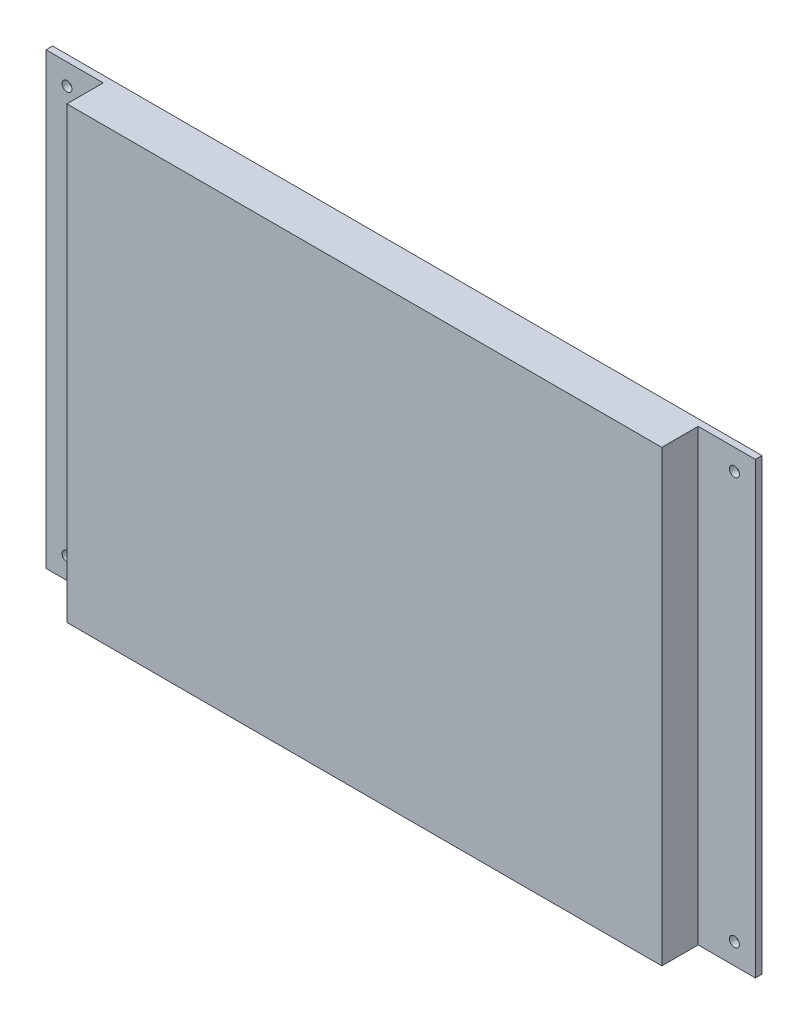
ISO-10303-21;
HEADER;
FILE_DESCRIPTION(('STEP AP214'),'2;1');
FILE_NAME('part.step','',(''),(''),'','','');
FILE_SCHEMA(('AUTOMOTIVE_DESIGN { 1 0 10303 214 1 1 1 1 }'));
ENDSEC;
DATA;
#1=APPLICATION_CONTEXT('core data for automotive mechanical design processes');
#2=APPLICATION_PROTOCOL_DEFINITION('international standard','automotive_design',2000,#1);
#3=PRODUCT_CONTEXT('',#1,'mechanical');
#4=PRODUCT('Part','Part','',(#3));
#5=PRODUCT_RELATED_PRODUCT_CATEGORY('part','',(#4));
#6=PRODUCT_DEFINITION_FORMATION('','',#4);
#7=PRODUCT_DEFINITION_CONTEXT('part definition',#1,'design');
#8=PRODUCT_DEFINITION('design','',#6,#7);
#9=PRODUCT_DEFINITION_SHAPE('','',#8);
#10=(LENGTH_UNIT() NAMED_UNIT(*) SI_UNIT(.MILLI.,.METRE.));
#11=(NAMED_UNIT(*) PLANE_ANGLE_UNIT() SI_UNIT($,.RADIAN.));
#12=(NAMED_UNIT(*) SI_UNIT($,.STERADIAN.) SOLID_ANGLE_UNIT());
#13=UNCERTAINTY_MEASURE_WITH_UNIT(LENGTH_MEASURE(1.E-05),#10,'distance_accuracy_value','');
#14=(GEOMETRIC_REPRESENTATION_CONTEXT(3) GLOBAL_UNCERTAINTY_ASSIGNED_CONTEXT((#13)) GLOBAL_UNIT_ASSIGNED_CONTEXT((#10,
#11,#12)) REPRESENTATION_CONTEXT('',''));
#15=CARTESIAN_POINT('',(0.,0.,0.));
#16=DIRECTION('',(0.,0.,1.));
#17=DIRECTION('',(1.,0.,0.));
#18=AXIS2_PLACEMENT_3D('',#15,#16,#17);
#19=CARTESIAN_POINT('',(0.,0.,2.));
#20=DIRECTION('',(0.,0.,-1.));
#21=DIRECTION('',(-1.,0.,0.));
#22=AXIS2_PLACEMENT_3D('',#19,#20,#21);
#23=PLANE('',#22);
#24=CARTESIAN_POINT('',(-100.965,61.595,2.));
#25=DIRECTION('',(0.,0.,1.));
#26=DIRECTION('',(-1.,0.,0.));
#27=AXIS2_PLACEMENT_3D('',#24,#25,#26);
#28=CIRCLE('',#27,1.5);
#29=CARTESIAN_POINT('',(-102.465,61.595,2.));
#30=VERTEX_POINT('',#29);
#31=EDGE_CURVE('E123',#30,#30,#28,.T.);
#32=ORIENTED_EDGE('',*,*,#31,.F.);
#33=EDGE_LOOP('',(#32));
#34=FACE_BOUND('',#33,.T.);
#35=CARTESIAN_POINT('',(-100.965,-61.595,2.));
#36=DIRECTION('',(0.,0.,1.));
#37=DIRECTION('',(-1.,0.,0.));
#38=AXIS2_PLACEMENT_3D('',#35,#36,#37);
#39=CIRCLE('',#38,1.5);
#40=CARTESIAN_POINT('',(-102.465,-61.595,2.));
#41=VERTEX_POINT('',#40);
#42=EDGE_CURVE('E132',#41,#41,#39,.T.);
#43=ORIENTED_EDGE('',*,*,#42,.F.);
#44=EDGE_LOOP('',(#43));
#45=FACE_BOUND('',#44,.T.);
#46=DIRECTION('',(0.,-1.,0.));
#47=VECTOR('',#46,1.);
#48=CARTESIAN_POINT('',(-90.,-67.945,2.));
#49=LINE('',#48,#47);
#50=CARTESIAN_POINT('',(-90.,67.945,2.));
#51=VERTEX_POINT('',#50);
#52=CARTESIAN_POINT('',(-90.,-67.945,2.));
#53=VERTEX_POINT('',#52);
#54=EDGE_CURVE('E119',#51,#53,#49,.T.);
#55=ORIENTED_EDGE('',*,*,#54,.F.);
#56=DIRECTION('',(-1.,0.,0.));
#57=VECTOR('',#56,1.);
#58=CARTESIAN_POINT('',(-107.315,67.945,2.));
#59=LINE('',#58,#57);
#60=CARTESIAN_POINT('',(-107.315,67.945,2.));
#61=VERTEX_POINT('',#60);
#62=EDGE_CURVE('E153',#51,#61,#59,.T.);
#63=ORIENTED_EDGE('',*,*,#62,.T.);
#64=DIRECTION('',(0.,-1.,0.));
#65=VECTOR('',#64,1.);
#66=CARTESIAN_POINT('',(-107.315,-67.945,2.));
#67=LINE('',#66,#65);
#68=CARTESIAN_POINT('',(-107.315,-67.945,2.));
#69=VERTEX_POINT('',#68);
#70=EDGE_CURVE('E157',#61,#69,#67,.T.);
#71=ORIENTED_EDGE('',*,*,#70,.T.);
#72=DIRECTION('',(1.,0.,0.));
#73=VECTOR('',#72,1.);
#74=CARTESIAN_POINT('',(-107.315,-67.945,2.));
#75=LINE('',#74,#73);
#76=EDGE_CURVE('E56',#69,#53,#75,.T.);
#77=ORIENTED_EDGE('',*,*,#76,.T.);
#78=EDGE_LOOP('',(#55,#63,#71,#77));
#79=FACE_BOUND('',#78,.T.);
#80=ADVANCED_FACE('F33',(#34,#45,#79),#23,.F.);
#81=CARTESIAN_POINT('',(100.965,-61.595,2.));
#82=DIRECTION('',(0.,0.,1.));
#83=DIRECTION('',(1.,0.,0.));
#84=AXIS2_PLACEMENT_3D('',#81,#82,#83);
#85=CIRCLE('',#84,1.5);
#86=CARTESIAN_POINT('',(102.465,-61.595,2.));
#87=VERTEX_POINT('',#86);
#88=EDGE_CURVE('E138',#87,#87,#85,.T.);
#89=ORIENTED_EDGE('',*,*,#88,.F.);
#90=EDGE_LOOP('',(#89));
#91=FACE_BOUND('',#90,.T.);
#92=CARTESIAN_POINT('',(100.965,61.595,2.));
#93=DIRECTION('',(0.,0.,1.));
#94=DIRECTION('',(1.,0.,0.));
#95=AXIS2_PLACEMENT_3D('',#92,#93,#94);
#96=CIRCLE('',#95,1.5);
#97=CARTESIAN_POINT('',(102.465,61.595,2.));
#98=VERTEX_POINT('',#97);
#99=EDGE_CURVE('E144',#98,#98,#96,.T.);
#100=ORIENTED_EDGE('',*,*,#99,.F.);
#101=EDGE_LOOP('',(#100));
#102=FACE_BOUND('',#101,.T.);
#103=DIRECTION('',(0.,1.,0.));
#104=VECTOR('',#103,1.);
#105=CARTESIAN_POINT('',(90.,-67.945,2.));
#106=LINE('',#105,#104);
#107=CARTESIAN_POINT('',(90.,-67.945,2.));
#108=VERTEX_POINT('',#107);
#109=CARTESIAN_POINT('',(90.,67.945,2.));
#110=VERTEX_POINT('',#109);
#111=EDGE_CURVE('E48',#108,#110,#106,.T.);
#112=ORIENTED_EDGE('',*,*,#111,.F.);
#113=CARTESIAN_POINT('',(107.315,-67.945,2.));
#114=VERTEX_POINT('',#113);
#115=EDGE_CURVE('E159',#108,#114,#75,.T.);
#116=ORIENTED_EDGE('',*,*,#115,.T.);
#117=DIRECTION('',(0.,1.,0.));
#118=VECTOR('',#117,1.);
#119=CARTESIAN_POINT('',(107.315,-67.945,2.));
#120=LINE('',#119,#118);
#121=CARTESIAN_POINT('',(107.315,67.945,2.));
#122=VERTEX_POINT('',#121);
#123=EDGE_CURVE('E150',#114,#122,#120,.T.);
#124=ORIENTED_EDGE('',*,*,#123,.T.);
#125=EDGE_CURVE('E155',#122,#110,#59,.T.);
#126=ORIENTED_EDGE('',*,*,#125,.T.);
#127=EDGE_LOOP('',(#112,#116,#124,#126));
#128=FACE_BOUND('',#127,.T.);
#129=ADVANCED_FACE('F191',(#91,#102,#128),#23,.F.);
#130=CARTESIAN_POINT('',(0.,0.,0.));
#131=DIRECTION('',(0.,0.,-1.));
#132=DIRECTION('',(-1.,0.,0.));
#133=AXIS2_PLACEMENT_3D('',#130,#131,#132);
#134=PLANE('',#133);
#135=CARTESIAN_POINT('',(-100.965,-61.595,0.));
#136=DIRECTION('',(0.,0.,1.));
#137=DIRECTION('',(-1.,0.,0.));
#138=AXIS2_PLACEMENT_3D('',#135,#136,#137);
#139=CIRCLE('',#138,1.5);
#140=CARTESIAN_POINT('',(-102.465,-61.595,0.));
#141=VERTEX_POINT('',#140);
#142=EDGE_CURVE('E130',#141,#141,#139,.T.);
#143=ORIENTED_EDGE('',*,*,#142,.T.);
#144=EDGE_LOOP('',(#143));
#145=FACE_BOUND('',#144,.T.);
#146=CARTESIAN_POINT('',(100.965,61.595,0.));
#147=DIRECTION('',(0.,0.,1.));
#148=DIRECTION('',(1.,0.,0.));
#149=AXIS2_PLACEMENT_3D('',#146,#147,#148);
#150=CIRCLE('',#149,1.5);
#151=CARTESIAN_POINT('',(102.465,61.595,0.));
#152=VERTEX_POINT('',#151);
#153=EDGE_CURVE('E141',#152,#152,#150,.T.);
#154=ORIENTED_EDGE('',*,*,#153,.T.);
#155=EDGE_LOOP('',(#154));
#156=FACE_BOUND('',#155,.T.);
#157=DIRECTION('',(0.,1.,0.));
#158=VECTOR('',#157,1.);
#159=CARTESIAN_POINT('',(107.315,-67.945,0.));
#160=LINE('',#159,#158);
#161=CARTESIAN_POINT('',(107.315,-67.945,0.));
#162=VERTEX_POINT('',#161);
#163=CARTESIAN_POINT('',(107.315,67.945,0.));
#164=VERTEX_POINT('',#163);
#165=EDGE_CURVE('E147',#162,#164,#160,.T.);
#166=ORIENTED_EDGE('',*,*,#165,.F.);
#167=DIRECTION('',(1.,0.,0.));
#168=VECTOR('',#167,1.);
#169=CARTESIAN_POINT('',(-107.315,-67.945,0.));
#170=LINE('',#169,#168);
#171=CARTESIAN_POINT('',(-107.315,-67.945,0.));
#172=VERTEX_POINT('',#171);
#173=EDGE_CURVE('E154',#172,#162,#170,.T.);
#174=ORIENTED_EDGE('',*,*,#173,.F.);
#175=DIRECTION('',(0.,-1.,0.));
#176=VECTOR('',#175,1.);
#177=CARTESIAN_POINT('',(-107.315,-67.945,0.));
#178=LINE('',#177,#176);
#179=CARTESIAN_POINT('',(-107.315,67.945,0.));
#180=VERTEX_POINT('',#179);
#181=EDGE_CURVE('E166',#180,#172,#178,.T.);
#182=ORIENTED_EDGE('',*,*,#181,.F.);
#183=DIRECTION('',(-1.,0.,0.));
#184=VECTOR('',#183,1.);
#185=CARTESIAN_POINT('',(-107.315,67.945,0.));
#186=LINE('',#185,#184);
#187=EDGE_CURVE('E164',#164,#180,#186,.T.);
#188=ORIENTED_EDGE('',*,*,#187,.F.);
#189=EDGE_LOOP('',(#166,#174,#182,#188));
#190=FACE_BOUND('',#189,.T.);
#191=CARTESIAN_POINT('',(100.965,-61.595,0.));
#192=DIRECTION('',(0.,0.,1.));
#193=DIRECTION('',(1.,0.,0.));
#194=AXIS2_PLACEMENT_3D('',#191,#192,#193);
#195=CIRCLE('',#194,1.5);
#196=CARTESIAN_POINT('',(102.465,-61.595,0.));
#197=VERTEX_POINT('',#196);
#198=EDGE_CURVE('E135',#197,#197,#195,.T.);
#199=ORIENTED_EDGE('',*,*,#198,.T.);
#200=EDGE_LOOP('',(#199));
#201=FACE_BOUND('',#200,.T.);
#202=CARTESIAN_POINT('',(-100.965,61.595,0.));
#203=DIRECTION('',(0.,0.,1.));
#204=DIRECTION('',(-1.,0.,0.));
#205=AXIS2_PLACEMENT_3D('',#202,#203,#204);
#206=CIRCLE('',#205,1.5);
#207=CARTESIAN_POINT('',(-102.465,61.595,0.));
#208=VERTEX_POINT('',#207);
#209=EDGE_CURVE('E120',#208,#208,#206,.T.);
#210=ORIENTED_EDGE('',*,*,#209,.T.);
#211=EDGE_LOOP('',(#210));
#212=FACE_BOUND('',#211,.T.);
#213=ADVANCED_FACE('F185',(#145,#156,#190,#201,#212),#134,.T.);
#214=CARTESIAN_POINT('',(107.315,-67.945,2.));
#215=DIRECTION('',(-1.,0.,0.));
#216=DIRECTION('',(0.,0.,1.));
#217=AXIS2_PLACEMENT_3D('',#214,#215,#216);
#218=PLANE('',#217);
#219=ORIENTED_EDGE('',*,*,#165,.T.);
#220=DIRECTION('',(0.,0.,-1.));
#221=VECTOR('',#220,1.);
#222=CARTESIAN_POINT('',(107.315,67.945,2.));
#223=LINE('',#222,#221);
#224=EDGE_CURVE('E11',#122,#164,#223,.T.);
#225=ORIENTED_EDGE('',*,*,#224,.F.);
#226=ORIENTED_EDGE('',*,*,#123,.F.);
#227=DIRECTION('',(0.,0.,-1.));
#228=VECTOR('',#227,1.);
#229=CARTESIAN_POINT('',(107.315,-67.945,2.));
#230=LINE('',#229,#228);
#231=EDGE_CURVE('E161',#114,#162,#230,.T.);
#232=ORIENTED_EDGE('',*,*,#231,.T.);
#233=EDGE_LOOP('',(#219,#225,#226,#232));
#234=FACE_BOUND('',#233,.T.);
#235=ADVANCED_FACE('F35',(#234),#218,.F.);
#236=CARTESIAN_POINT('',(-107.315,67.945,2.));
#237=DIRECTION('',(0.,-1.,0.));
#238=DIRECTION('',(0.,0.,-1.));
#239=AXIS2_PLACEMENT_3D('',#236,#237,#238);
#240=PLANE('',#239);
#241=ORIENTED_EDGE('',*,*,#187,.T.);
#242=DIRECTION('',(0.,0.,-1.));
#243=VECTOR('',#242,1.);
#244=CARTESIAN_POINT('',(-107.315,67.945,2.));
#245=LINE('',#244,#243);
#246=EDGE_CURVE('E41',#61,#180,#245,.T.);
#247=ORIENTED_EDGE('',*,*,#246,.F.);
#248=ORIENTED_EDGE('',*,*,#62,.F.);
#249=DIRECTION('',(0.,0.,-1.));
#250=VECTOR('',#249,1.);
#251=CARTESIAN_POINT('',(-90.,67.945,13.));
#252=LINE('',#251,#250);
#253=CARTESIAN_POINT('',(-90.,67.945,13.));
#254=VERTEX_POINT('',#253);
#255=EDGE_CURVE('E197',#254,#51,#252,.T.);
#256=ORIENTED_EDGE('',*,*,#255,.F.);
#257=DIRECTION('',(-1.,0.,0.));
#258=VECTOR('',#257,1.);
#259=CARTESIAN_POINT('',(-90.,67.945,13.));
#260=LINE('',#259,#258);
#261=CARTESIAN_POINT('',(90.,67.945,13.));
#262=VERTEX_POINT('',#261);
#263=EDGE_CURVE('E113',#262,#254,#260,.T.);
#264=ORIENTED_EDGE('',*,*,#263,.F.);
#265=DIRECTION('',(0.,0.,-1.));
#266=VECTOR('',#265,1.);
#267=CARTESIAN_POINT('',(90.,67.945,13.));
#268=LINE('',#267,#266);
#269=EDGE_CURVE('E125',#262,#110,#268,.T.);
#270=ORIENTED_EDGE('',*,*,#269,.T.);
#271=ORIENTED_EDGE('',*,*,#125,.F.);
#272=ORIENTED_EDGE('',*,*,#224,.T.);
#273=EDGE_LOOP('',(#241,#247,#248,#256,#264,#270,#271,#272));
#274=FACE_BOUND('',#273,.T.);
#275=ADVANCED_FACE('F202',(#274),#240,.F.);
#276=CARTESIAN_POINT('',(-107.315,-67.945,2.));
#277=DIRECTION('',(1.,0.,0.));
#278=DIRECTION('',(0.,0.,-1.));
#279=AXIS2_PLACEMENT_3D('',#276,#277,#278);
#280=PLANE('',#279);
#281=ORIENTED_EDGE('',*,*,#181,.T.);
#282=DIRECTION('',(0.,0.,-1.));
#283=VECTOR('',#282,1.);
#284=CARTESIAN_POINT('',(-107.315,-67.945,2.));
#285=LINE('',#284,#283);
#286=EDGE_CURVE('E171',#69,#172,#285,.T.);
#287=ORIENTED_EDGE('',*,*,#286,.F.);
#288=ORIENTED_EDGE('',*,*,#70,.F.);
#289=ORIENTED_EDGE('',*,*,#246,.T.);
#290=EDGE_LOOP('',(#281,#287,#288,#289));
#291=FACE_BOUND('',#290,.T.);
#292=ADVANCED_FACE('F178',(#291),#280,.F.);
#293=CARTESIAN_POINT('',(-107.315,-67.945,2.));
#294=DIRECTION('',(0.,1.,0.));
#295=DIRECTION('',(0.,0.,1.));
#296=AXIS2_PLACEMENT_3D('',#293,#294,#295);
#297=PLANE('',#296);
#298=ORIENTED_EDGE('',*,*,#173,.T.);
#299=ORIENTED_EDGE('',*,*,#231,.F.);
#300=ORIENTED_EDGE('',*,*,#115,.F.);
#301=DIRECTION('',(0.,0.,-1.));
#302=VECTOR('',#301,1.);
#303=CARTESIAN_POINT('',(90.,-67.945,13.));
#304=LINE('',#303,#302);
#305=CARTESIAN_POINT('',(90.,-67.945,13.));
#306=VERTEX_POINT('',#305);
#307=EDGE_CURVE('E104',#306,#108,#304,.T.);
#308=ORIENTED_EDGE('',*,*,#307,.F.);
#309=DIRECTION('',(1.,0.,0.));
#310=VECTOR('',#309,1.);
#311=CARTESIAN_POINT('',(-90.,-67.945,13.));
#312=LINE('',#311,#310);
#313=CARTESIAN_POINT('',(-90.,-67.945,13.));
#314=VERTEX_POINT('',#313);
#315=EDGE_CURVE('E97',#314,#306,#312,.T.);
#316=ORIENTED_EDGE('',*,*,#315,.F.);
#317=DIRECTION('',(0.,0.,-1.));
#318=VECTOR('',#317,1.);
#319=CARTESIAN_POINT('',(-90.,-67.945,13.));
#320=LINE('',#319,#318);
#321=EDGE_CURVE('E101',#314,#53,#320,.T.);
#322=ORIENTED_EDGE('',*,*,#321,.T.);
#323=ORIENTED_EDGE('',*,*,#76,.F.);
#324=ORIENTED_EDGE('',*,*,#286,.T.);
#325=EDGE_LOOP('',(#298,#299,#300,#308,#316,#322,#323,#324));
#326=FACE_BOUND('',#325,.T.);
#327=ADVANCED_FACE('F99',(#326),#297,.F.);
#328=CARTESIAN_POINT('',(100.965,61.595,2.));
#329=DIRECTION('',(0.,0.,-1.));
#330=DIRECTION('',(-1.,0.,0.));
#331=AXIS2_PLACEMENT_3D('',#328,#329,#330);
#332=CYLINDRICAL_SURFACE('',#331,1.5);
#333=ORIENTED_EDGE('',*,*,#99,.T.);
#334=EDGE_LOOP('',(#333));
#335=FACE_BOUND('',#334,.T.);
#336=ORIENTED_EDGE('',*,*,#153,.F.);
#337=EDGE_LOOP('',(#336));
#338=FACE_BOUND('',#337,.T.);
#339=ADVANCED_FACE('F214',(#335,#338),#332,.F.);
#340=CARTESIAN_POINT('',(100.965,-61.595,2.));
#341=DIRECTION('',(0.,0.,-1.));
#342=DIRECTION('',(-1.,0.,0.));
#343=AXIS2_PLACEMENT_3D('',#340,#341,#342);
#344=CYLINDRICAL_SURFACE('',#343,1.5);
#345=ORIENTED_EDGE('',*,*,#88,.T.);
#346=EDGE_LOOP('',(#345));
#347=FACE_BOUND('',#346,.T.);
#348=ORIENTED_EDGE('',*,*,#198,.F.);
#349=EDGE_LOOP('',(#348));
#350=FACE_BOUND('',#349,.T.);
#351=ADVANCED_FACE('F289',(#347,#350),#344,.F.);
#352=CARTESIAN_POINT('',(-100.965,-61.595,2.));
#353=DIRECTION('',(0.,0.,-1.));
#354=DIRECTION('',(-1.,0.,0.));
#355=AXIS2_PLACEMENT_3D('',#352,#353,#354);
#356=CYLINDRICAL_SURFACE('',#355,1.5);
#357=ORIENTED_EDGE('',*,*,#42,.T.);
#358=EDGE_LOOP('',(#357));
#359=FACE_BOUND('',#358,.T.);
#360=ORIENTED_EDGE('',*,*,#142,.F.);
#361=EDGE_LOOP('',(#360));
#362=FACE_BOUND('',#361,.T.);
#363=ADVANCED_FACE('F286',(#359,#362),#356,.F.);
#364=CARTESIAN_POINT('',(-100.965,61.595,2.));
#365=DIRECTION('',(0.,0.,-1.));
#366=DIRECTION('',(-1.,0.,0.));
#367=AXIS2_PLACEMENT_3D('',#364,#365,#366);
#368=CYLINDRICAL_SURFACE('',#367,1.5);
#369=ORIENTED_EDGE('',*,*,#31,.T.);
#370=EDGE_LOOP('',(#369));
#371=FACE_BOUND('',#370,.T.);
#372=ORIENTED_EDGE('',*,*,#209,.F.);
#373=EDGE_LOOP('',(#372));
#374=FACE_BOUND('',#373,.T.);
#375=ADVANCED_FACE('F263',(#371,#374),#368,.F.);
#376=CARTESIAN_POINT('',(-90.,-67.945,13.));
#377=DIRECTION('',(1.,0.,0.));
#378=DIRECTION('',(0.,0.,-1.));
#379=AXIS2_PLACEMENT_3D('',#376,#377,#378);
#380=PLANE('',#379);
#381=ORIENTED_EDGE('',*,*,#54,.T.);
#382=ORIENTED_EDGE('',*,*,#321,.F.);
#383=DIRECTION('',(0.,-1.,0.));
#384=VECTOR('',#383,1.);
#385=CARTESIAN_POINT('',(-90.,-67.945,13.));
#386=LINE('',#385,#384);
#387=EDGE_CURVE('E108',#254,#314,#386,.T.);
#388=ORIENTED_EDGE('',*,*,#387,.F.);
#389=ORIENTED_EDGE('',*,*,#255,.T.);
#390=EDGE_LOOP('',(#381,#382,#388,#389));
#391=FACE_BOUND('',#390,.T.);
#392=ADVANCED_FACE('F118',(#391),#380,.F.);
#393=CARTESIAN_POINT('',(90.,-67.945,13.));
#394=DIRECTION('',(-1.,0.,0.));
#395=DIRECTION('',(0.,-1.,0.));
#396=AXIS2_PLACEMENT_3D('',#393,#394,#395);
#397=PLANE('',#396);
#398=ORIENTED_EDGE('',*,*,#111,.T.);
#399=ORIENTED_EDGE('',*,*,#269,.F.);
#400=DIRECTION('',(0.,1.,0.));
#401=VECTOR('',#400,1.);
#402=CARTESIAN_POINT('',(90.,-67.945,13.));
#403=LINE('',#402,#401);
#404=EDGE_CURVE('E107',#306,#262,#403,.T.);
#405=ORIENTED_EDGE('',*,*,#404,.F.);
#406=ORIENTED_EDGE('',*,*,#307,.T.);
#407=EDGE_LOOP('',(#398,#399,#405,#406));
#408=FACE_BOUND('',#407,.T.);
#409=ADVANCED_FACE('F193',(#408),#397,.F.);
#410=CARTESIAN_POINT('',(0.,0.,13.));
#411=DIRECTION('',(0.,0.,-1.));
#412=DIRECTION('',(-1.,0.,0.));
#413=AXIS2_PLACEMENT_3D('',#410,#411,#412);
#414=PLANE('',#413);
#415=ORIENTED_EDGE('',*,*,#387,.T.);
#416=ORIENTED_EDGE('',*,*,#315,.T.);
#417=ORIENTED_EDGE('',*,*,#404,.T.);
#418=ORIENTED_EDGE('',*,*,#263,.T.);
#419=EDGE_LOOP('',(#415,#416,#417,#418));
#420=FACE_BOUND('',#419,.T.);
#421=ADVANCED_FACE('F111',(#420),#414,.F.);
#422=CLOSED_SHELL('',(#80,#129,#213,#235,#275,#292,#327,#339,#351,#363,#375,#392,#409,#421));
#423=MANIFOLD_SOLID_BREP('B2',#422);
#424=ADVANCED_BREP_SHAPE_REPRESENTATION('',(#18,#423),#14);
#425=SHAPE_DEFINITION_REPRESENTATION(#9,#424);
ENDSEC;
END-ISO-10303-21;
